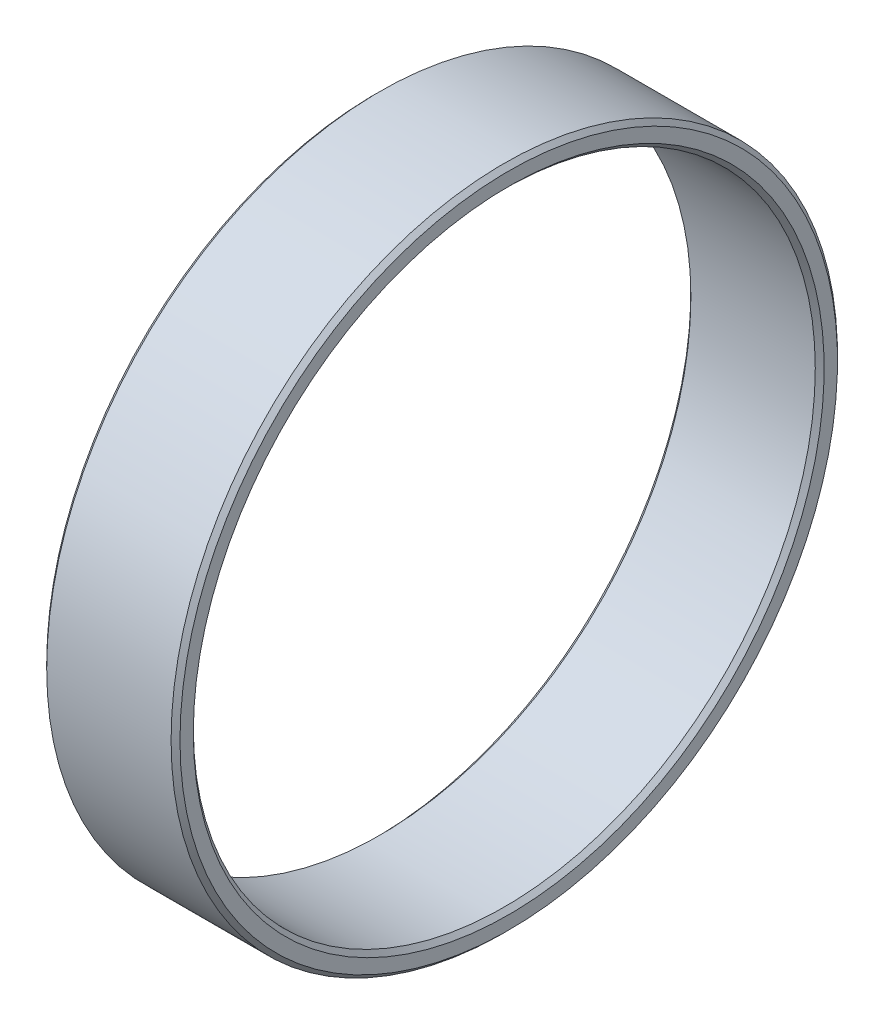
ISO-10303-21;
HEADER;
FILE_DESCRIPTION(('STEP AP214'),'2;1');
FILE_NAME('part.step','',(''),(''),'','','');
FILE_SCHEMA(('AUTOMOTIVE_DESIGN { 1 0 10303 214 1 1 1 1 }'));
ENDSEC;
DATA;
#1=APPLICATION_CONTEXT('core data for automotive mechanical design processes');
#2=APPLICATION_PROTOCOL_DEFINITION('international standard','automotive_design',2000,#1);
#3=PRODUCT_CONTEXT('',#1,'mechanical');
#4=PRODUCT('Part','Part','',(#3));
#5=PRODUCT_RELATED_PRODUCT_CATEGORY('part','',(#4));
#6=PRODUCT_DEFINITION_FORMATION('','',#4);
#7=PRODUCT_DEFINITION_CONTEXT('part definition',#1,'design');
#8=PRODUCT_DEFINITION('design','',#6,#7);
#9=PRODUCT_DEFINITION_SHAPE('','',#8);
#10=(LENGTH_UNIT() NAMED_UNIT(*) SI_UNIT(.MILLI.,.METRE.));
#11=(NAMED_UNIT(*) PLANE_ANGLE_UNIT() SI_UNIT($,.RADIAN.));
#12=(NAMED_UNIT(*) SI_UNIT($,.STERADIAN.) SOLID_ANGLE_UNIT());
#13=UNCERTAINTY_MEASURE_WITH_UNIT(LENGTH_MEASURE(1.E-05),#10,'distance_accuracy_value','');
#14=(GEOMETRIC_REPRESENTATION_CONTEXT(3) GLOBAL_UNCERTAINTY_ASSIGNED_CONTEXT((#13)) GLOBAL_UNIT_ASSIGNED_CONTEXT((#10,
#11,#12)) REPRESENTATION_CONTEXT('',''));
#15=CARTESIAN_POINT('',(0.,0.,0.));
#16=DIRECTION('',(0.,0.,1.));
#17=DIRECTION('',(1.,0.,0.));
#18=AXIS2_PLACEMENT_3D('',#15,#16,#17);
#19=CARTESIAN_POINT('',(0.,35.5,0.));
#20=DIRECTION('',(1.,0.,0.));
#21=DIRECTION('',(0.,0.,-1.));
#22=AXIS2_PLACEMENT_3D('',#19,#20,#21);
#23=PLANE('',#22);
#24=CARTESIAN_POINT('',(0.,0.,0.));
#25=DIRECTION('',(-1.,0.,0.));
#26=DIRECTION('',(0.,0.,1.));
#27=AXIS2_PLACEMENT_3D('',#24,#25,#26);
#28=CIRCLE('',#27,35.5);
#29=CARTESIAN_POINT('',(0.,0.,35.5));
#30=VERTEX_POINT('',#29);
#31=EDGE_CURVE('E75',#30,#30,#28,.T.);
#32=ORIENTED_EDGE('',*,*,#31,.F.);
#33=EDGE_LOOP('',(#32));
#34=FACE_BOUND('',#33,.T.);
#35=CARTESIAN_POINT('',(0.,0.,0.));
#36=DIRECTION('',(-1.,0.,0.));
#37=DIRECTION('',(0.,0.,1.));
#38=AXIS2_PLACEMENT_3D('',#35,#36,#37);
#39=CIRCLE('',#38,37.);
#40=CARTESIAN_POINT('',(0.,0.,37.));
#41=VERTEX_POINT('',#40);
#42=EDGE_CURVE('E10',#41,#41,#39,.T.);
#43=ORIENTED_EDGE('',*,*,#42,.T.);
#44=EDGE_LOOP('',(#43));
#45=FACE_BOUND('',#44,.T.);
#46=ADVANCED_FACE('F40',(#34,#45),#23,.F.);
#47=CARTESIAN_POINT('',(0.499999999999998,0.,0.));
#48=DIRECTION('',(1.,0.,0.));
#49=DIRECTION('',(0.,0.,-1.));
#50=AXIS2_PLACEMENT_3D('',#47,#48,#49);
#51=CONICAL_SURFACE('',#50,37.5,0.78539816339745);
#52=ORIENTED_EDGE('',*,*,#42,.F.);
#53=EDGE_LOOP('',(#52));
#54=FACE_BOUND('',#53,.T.);
#55=CARTESIAN_POINT('',(0.499999999999998,0.,0.));
#56=DIRECTION('',(-1.,0.,0.));
#57=DIRECTION('',(0.,0.,1.));
#58=AXIS2_PLACEMENT_3D('',#55,#56,#57);
#59=CIRCLE('',#58,37.5);
#60=CARTESIAN_POINT('',(0.499999999999998,0.,37.5));
#61=VERTEX_POINT('',#60);
#62=EDGE_CURVE('E47',#61,#61,#59,.T.);
#63=ORIENTED_EDGE('',*,*,#62,.T.);
#64=EDGE_LOOP('',(#63));
#65=FACE_BOUND('',#64,.T.);
#66=ADVANCED_FACE('F83',(#54,#65),#51,.T.);
#67=CARTESIAN_POINT('',(0.,0.,0.));
#68=DIRECTION('',(-1.,0.,0.));
#69=DIRECTION('',(0.,0.,1.));
#70=AXIS2_PLACEMENT_3D('',#67,#68,#69);
#71=CYLINDRICAL_SURFACE('',#70,37.5);
#72=ORIENTED_EDGE('',*,*,#62,.F.);
#73=EDGE_LOOP('',(#72));
#74=FACE_BOUND('',#73,.T.);
#75=CARTESIAN_POINT('',(14.5,0.,0.));
#76=DIRECTION('',(-1.,0.,0.));
#77=DIRECTION('',(0.,0.,1.));
#78=AXIS2_PLACEMENT_3D('',#75,#76,#77);
#79=CIRCLE('',#78,37.5);
#80=CARTESIAN_POINT('',(14.5,0.,37.5));
#81=VERTEX_POINT('',#80);
#82=EDGE_CURVE('E52',#81,#81,#79,.T.);
#83=ORIENTED_EDGE('',*,*,#82,.T.);
#84=EDGE_LOOP('',(#83));
#85=FACE_BOUND('',#84,.T.);
#86=ADVANCED_FACE('F87',(#74,#85),#71,.T.);
#87=CARTESIAN_POINT('',(15.,0.,0.));
#88=DIRECTION('',(-1.,0.,0.));
#89=DIRECTION('',(0.,0.,1.));
#90=AXIS2_PLACEMENT_3D('',#87,#88,#89);
#91=CONICAL_SURFACE('',#90,37.,0.785398163397448);
#92=ORIENTED_EDGE('',*,*,#82,.F.);
#93=EDGE_LOOP('',(#92));
#94=FACE_BOUND('',#93,.T.);
#95=CARTESIAN_POINT('',(15.,0.,0.));
#96=DIRECTION('',(-1.,0.,0.));
#97=DIRECTION('',(0.,0.,1.));
#98=AXIS2_PLACEMENT_3D('',#95,#96,#97);
#99=CIRCLE('',#98,37.);
#100=CARTESIAN_POINT('',(15.,0.,37.));
#101=VERTEX_POINT('',#100);
#102=EDGE_CURVE('E57',#101,#101,#99,.T.);
#103=ORIENTED_EDGE('',*,*,#102,.T.);
#104=EDGE_LOOP('',(#103));
#105=FACE_BOUND('',#104,.T.);
#106=ADVANCED_FACE('F92',(#94,#105),#91,.T.);
#107=CARTESIAN_POINT('',(15.,35.5,0.));
#108=DIRECTION('',(-1.,0.,0.));
#109=DIRECTION('',(0.,0.,1.));
#110=AXIS2_PLACEMENT_3D('',#107,#108,#109);
#111=PLANE('',#110);
#112=ORIENTED_EDGE('',*,*,#102,.F.);
#113=EDGE_LOOP('',(#112));
#114=FACE_BOUND('',#113,.T.);
#115=CARTESIAN_POINT('',(15.,0.,0.));
#116=DIRECTION('',(-1.,0.,0.));
#117=DIRECTION('',(0.,0.,1.));
#118=AXIS2_PLACEMENT_3D('',#115,#116,#117);
#119=CIRCLE('',#118,35.5);
#120=CARTESIAN_POINT('',(15.,0.,35.5));
#121=VERTEX_POINT('',#120);
#122=EDGE_CURVE('E63',#121,#121,#119,.T.);
#123=ORIENTED_EDGE('',*,*,#122,.T.);
#124=EDGE_LOOP('',(#123));
#125=FACE_BOUND('',#124,.T.);
#126=ADVANCED_FACE('F98',(#114,#125),#111,.F.);
#127=CARTESIAN_POINT('',(14.5,0.,0.));
#128=DIRECTION('',(1.,0.,0.));
#129=DIRECTION('',(0.,0.,-1.));
#130=AXIS2_PLACEMENT_3D('',#127,#128,#129);
#131=CONICAL_SURFACE('',#130,35.,0.785398163397448);
#132=ORIENTED_EDGE('',*,*,#122,.F.);
#133=EDGE_LOOP('',(#132));
#134=FACE_BOUND('',#133,.T.);
#135=CARTESIAN_POINT('',(14.5,0.,0.));
#136=DIRECTION('',(-1.,0.,0.));
#137=DIRECTION('',(0.,0.,1.));
#138=AXIS2_PLACEMENT_3D('',#135,#136,#137);
#139=CIRCLE('',#138,35.);
#140=CARTESIAN_POINT('',(14.5,0.,35.));
#141=VERTEX_POINT('',#140);
#142=EDGE_CURVE('E67',#141,#141,#139,.T.);
#143=ORIENTED_EDGE('',*,*,#142,.T.);
#144=EDGE_LOOP('',(#143));
#145=FACE_BOUND('',#144,.T.);
#146=ADVANCED_FACE('F102',(#134,#145),#131,.F.);
#147=CARTESIAN_POINT('',(0.,0.,0.));
#148=DIRECTION('',(-1.,0.,0.));
#149=DIRECTION('',(0.,0.,1.));
#150=AXIS2_PLACEMENT_3D('',#147,#148,#149);
#151=CYLINDRICAL_SURFACE('',#150,35.);
#152=ORIENTED_EDGE('',*,*,#142,.F.);
#153=EDGE_LOOP('',(#152));
#154=FACE_BOUND('',#153,.T.);
#155=CARTESIAN_POINT('',(0.5,0.,0.));
#156=DIRECTION('',(-1.,0.,0.));
#157=DIRECTION('',(0.,0.,1.));
#158=AXIS2_PLACEMENT_3D('',#155,#156,#157);
#159=CIRCLE('',#158,35.);
#160=CARTESIAN_POINT('',(0.5,0.,35.));
#161=VERTEX_POINT('',#160);
#162=EDGE_CURVE('E71',#161,#161,#159,.T.);
#163=ORIENTED_EDGE('',*,*,#162,.T.);
#164=EDGE_LOOP('',(#163));
#165=FACE_BOUND('',#164,.T.);
#166=ADVANCED_FACE('F106',(#154,#165),#151,.F.);
#167=CARTESIAN_POINT('',(0.,0.,0.));
#168=DIRECTION('',(-1.,0.,0.));
#169=DIRECTION('',(0.,0.,1.));
#170=AXIS2_PLACEMENT_3D('',#167,#168,#169);
#171=CONICAL_SURFACE('',#170,35.5,0.785398163397449);
#172=ORIENTED_EDGE('',*,*,#162,.F.);
#173=EDGE_LOOP('',(#172));
#174=FACE_BOUND('',#173,.T.);
#175=ORIENTED_EDGE('',*,*,#31,.T.);
#176=EDGE_LOOP('',(#175));
#177=FACE_BOUND('',#176,.T.);
#178=ADVANCED_FACE('F80',(#174,#177),#171,.F.);
#179=CLOSED_SHELL('',(#46,#66,#86,#106,#126,#146,#166,#178));
#180=MANIFOLD_SOLID_BREP('B2',#179);
#181=ADVANCED_BREP_SHAPE_REPRESENTATION('',(#18,#180),#14);
#182=SHAPE_DEFINITION_REPRESENTATION(#9,#181);
ENDSEC;
END-ISO-10303-21;
